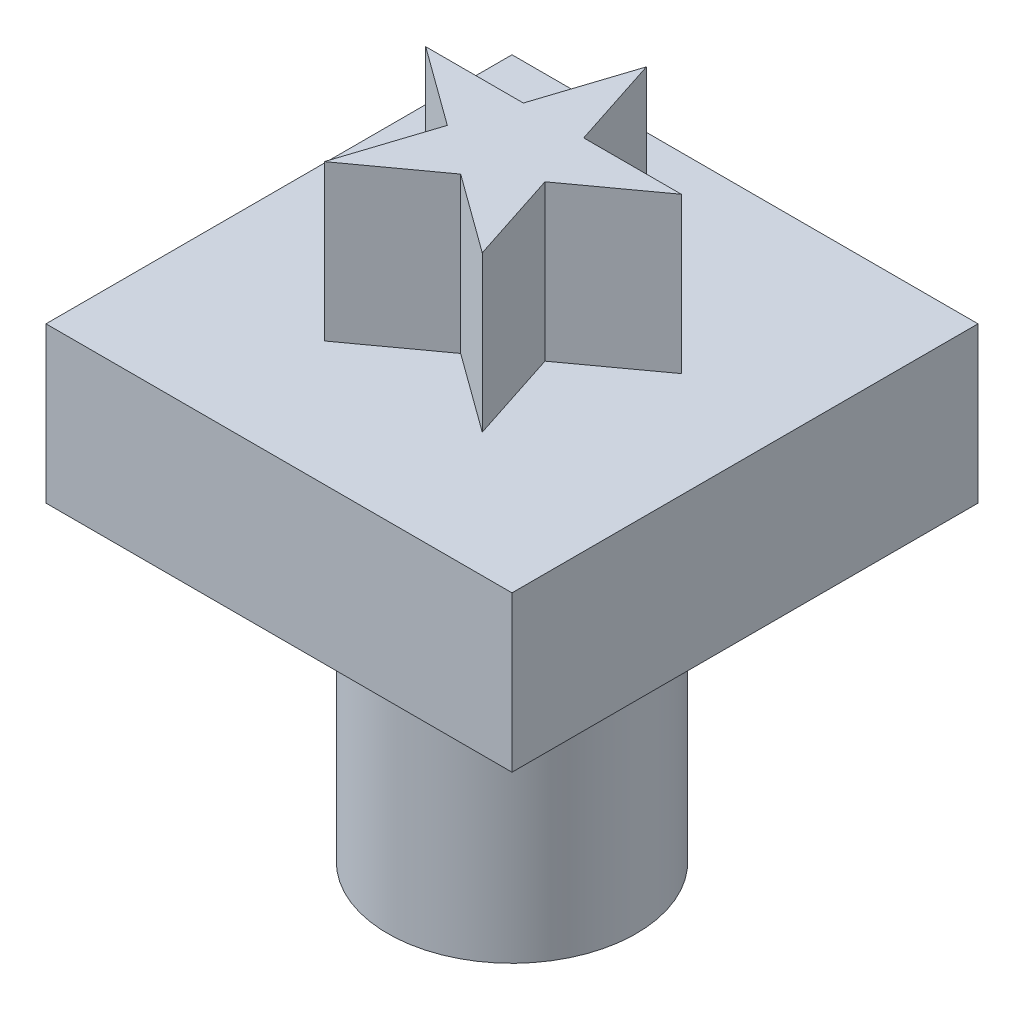
ISO-10303-21;
HEADER;
FILE_DESCRIPTION(('STEP AP214'),'2;1');
FILE_NAME('part.step','',(''),(''),'','','');
FILE_SCHEMA(('AUTOMOTIVE_DESIGN { 1 0 10303 214 1 1 1 1 }'));
ENDSEC;
DATA;
#1=APPLICATION_CONTEXT('core data for automotive mechanical design processes');
#2=APPLICATION_PROTOCOL_DEFINITION('international standard','automotive_design',2000,#1);
#3=PRODUCT_CONTEXT('',#1,'mechanical');
#4=PRODUCT('Part','Part','',(#3));
#5=PRODUCT_RELATED_PRODUCT_CATEGORY('part','',(#4));
#6=PRODUCT_DEFINITION_FORMATION('','',#4);
#7=PRODUCT_DEFINITION_CONTEXT('part definition',#1,'design');
#8=PRODUCT_DEFINITION('design','',#6,#7);
#9=PRODUCT_DEFINITION_SHAPE('','',#8);
#10=(LENGTH_UNIT() NAMED_UNIT(*) SI_UNIT(.MILLI.,.METRE.));
#11=(NAMED_UNIT(*) PLANE_ANGLE_UNIT() SI_UNIT($,.RADIAN.));
#12=(NAMED_UNIT(*) SI_UNIT($,.STERADIAN.) SOLID_ANGLE_UNIT());
#13=UNCERTAINTY_MEASURE_WITH_UNIT(LENGTH_MEASURE(1.E-05),#10,'distance_accuracy_value','');
#14=(GEOMETRIC_REPRESENTATION_CONTEXT(3) GLOBAL_UNCERTAINTY_ASSIGNED_CONTEXT((#13)) GLOBAL_UNIT_ASSIGNED_CONTEXT((#10,
#11,#12)) REPRESENTATION_CONTEXT('',''));
#15=CARTESIAN_POINT('',(0.,0.,0.));
#16=DIRECTION('',(0.,0.,1.));
#17=DIRECTION('',(1.,0.,0.));
#18=AXIS2_PLACEMENT_3D('',#15,#16,#17);
#19=CARTESIAN_POINT('',(-7.5,5.,7.5));
#20=DIRECTION('',(1.,0.,0.));
#21=DIRECTION('',(0.,0.,-1.));
#22=AXIS2_PLACEMENT_3D('',#19,#20,#21);
#23=PLANE('',#22);
#24=DIRECTION('',(0.,0.,1.));
#25=VECTOR('',#24,1.);
#26=CARTESIAN_POINT('',(-7.5,0.,7.5));
#27=LINE('',#26,#25);
#28=CARTESIAN_POINT('',(-7.5,0.,-7.5));
#29=VERTEX_POINT('',#28);
#30=CARTESIAN_POINT('',(-7.5,0.,7.5));
#31=VERTEX_POINT('',#30);
#32=EDGE_CURVE('E161',#29,#31,#27,.T.);
#33=ORIENTED_EDGE('',*,*,#32,.T.);
#34=DIRECTION('',(0.,-1.,0.));
#35=VECTOR('',#34,1.);
#36=CARTESIAN_POINT('',(-7.5,5.,7.5));
#37=LINE('',#36,#35);
#38=CARTESIAN_POINT('',(-7.5,5.,7.5));
#39=VERTEX_POINT('',#38);
#40=EDGE_CURVE('E40',#39,#31,#37,.T.);
#41=ORIENTED_EDGE('',*,*,#40,.F.);
#42=DIRECTION('',(0.,0.,1.));
#43=VECTOR('',#42,1.);
#44=CARTESIAN_POINT('',(-7.5,5.,7.5));
#45=LINE('',#44,#43);
#46=CARTESIAN_POINT('',(-7.5,5.,-7.5));
#47=VERTEX_POINT('',#46);
#48=EDGE_CURVE('E167',#47,#39,#45,.T.);
#49=ORIENTED_EDGE('',*,*,#48,.F.);
#50=DIRECTION('',(0.,-1.,0.));
#51=VECTOR('',#50,1.);
#52=CARTESIAN_POINT('',(-7.5,5.,-7.5));
#53=LINE('',#52,#51);
#54=EDGE_CURVE('E177',#47,#29,#53,.T.);
#55=ORIENTED_EDGE('',*,*,#54,.T.);
#56=EDGE_LOOP('',(#33,#41,#49,#55));
#57=FACE_BOUND('',#56,.T.);
#58=ADVANCED_FACE('F37',(#57),#23,.F.);
#59=CARTESIAN_POINT('',(7.5,5.,7.5));
#60=DIRECTION('',(0.,0.,-1.));
#61=DIRECTION('',(-1.,0.,0.));
#62=AXIS2_PLACEMENT_3D('',#59,#60,#61);
#63=PLANE('',#62);
#64=DIRECTION('',(1.,0.,0.));
#65=VECTOR('',#64,1.);
#66=CARTESIAN_POINT('',(7.5,0.,7.5));
#67=LINE('',#66,#65);
#68=CARTESIAN_POINT('',(7.5,0.,7.5));
#69=VERTEX_POINT('',#68);
#70=EDGE_CURVE('E180',#31,#69,#67,.T.);
#71=ORIENTED_EDGE('',*,*,#70,.T.);
#72=DIRECTION('',(0.,-1.,0.));
#73=VECTOR('',#72,1.);
#74=CARTESIAN_POINT('',(7.5,5.,7.5));
#75=LINE('',#74,#73);
#76=CARTESIAN_POINT('',(7.5,5.,7.5));
#77=VERTEX_POINT('',#76);
#78=EDGE_CURVE('E189',#77,#69,#75,.T.);
#79=ORIENTED_EDGE('',*,*,#78,.F.);
#80=DIRECTION('',(1.,0.,0.));
#81=VECTOR('',#80,1.);
#82=CARTESIAN_POINT('',(7.5,5.,7.5));
#83=LINE('',#82,#81);
#84=EDGE_CURVE('E170',#39,#77,#83,.T.);
#85=ORIENTED_EDGE('',*,*,#84,.F.);
#86=ORIENTED_EDGE('',*,*,#40,.T.);
#87=EDGE_LOOP('',(#71,#79,#85,#86));
#88=FACE_BOUND('',#87,.T.);
#89=ADVANCED_FACE('F198',(#88),#63,.F.);
#90=CARTESIAN_POINT('',(7.5,5.,7.5));
#91=DIRECTION('',(-1.,0.,0.));
#92=DIRECTION('',(0.,0.,1.));
#93=AXIS2_PLACEMENT_3D('',#90,#91,#92);
#94=PLANE('',#93);
#95=DIRECTION('',(0.,0.,-1.));
#96=VECTOR('',#95,1.);
#97=CARTESIAN_POINT('',(7.5,0.,7.5));
#98=LINE('',#97,#96);
#99=CARTESIAN_POINT('',(7.5,0.,-7.5));
#100=VERTEX_POINT('',#99);
#101=EDGE_CURVE('E182',#69,#100,#98,.T.);
#102=ORIENTED_EDGE('',*,*,#101,.T.);
#103=DIRECTION('',(0.,-1.,0.));
#104=VECTOR('',#103,1.);
#105=CARTESIAN_POINT('',(7.5,5.,-7.5));
#106=LINE('',#105,#104);
#107=CARTESIAN_POINT('',(7.5,5.,-7.5));
#108=VERTEX_POINT('',#107);
#109=EDGE_CURVE('E187',#108,#100,#106,.T.);
#110=ORIENTED_EDGE('',*,*,#109,.F.);
#111=DIRECTION('',(0.,0.,-1.));
#112=VECTOR('',#111,1.);
#113=CARTESIAN_POINT('',(7.5,5.,7.5));
#114=LINE('',#113,#112);
#115=EDGE_CURVE('E173',#77,#108,#114,.T.);
#116=ORIENTED_EDGE('',*,*,#115,.F.);
#117=ORIENTED_EDGE('',*,*,#78,.T.);
#118=EDGE_LOOP('',(#102,#110,#116,#117));
#119=FACE_BOUND('',#118,.T.);
#120=ADVANCED_FACE('F207',(#119),#94,.F.);
#121=CARTESIAN_POINT('',(7.5,5.,-7.5));
#122=DIRECTION('',(0.,0.,1.));
#123=DIRECTION('',(1.,0.,0.));
#124=AXIS2_PLACEMENT_3D('',#121,#122,#123);
#125=PLANE('',#124);
#126=DIRECTION('',(-1.,0.,0.));
#127=VECTOR('',#126,1.);
#128=CARTESIAN_POINT('',(7.5,0.,-7.5));
#129=LINE('',#128,#127);
#130=EDGE_CURVE('E171',#100,#29,#129,.T.);
#131=ORIENTED_EDGE('',*,*,#130,.T.);
#132=ORIENTED_EDGE('',*,*,#54,.F.);
#133=DIRECTION('',(-1.,0.,0.));
#134=VECTOR('',#133,1.);
#135=CARTESIAN_POINT('',(7.5,5.,-7.5));
#136=LINE('',#135,#134);
#137=EDGE_CURVE('E175',#108,#47,#136,.T.);
#138=ORIENTED_EDGE('',*,*,#137,.F.);
#139=ORIENTED_EDGE('',*,*,#109,.T.);
#140=EDGE_LOOP('',(#131,#132,#138,#139));
#141=FACE_BOUND('',#140,.T.);
#142=ADVANCED_FACE('F210',(#141),#125,.F.);
#143=CARTESIAN_POINT('',(0.,5.,0.));
#144=DIRECTION('',(0.,1.,0.));
#145=DIRECTION('',(0.,0.,1.));
#146=AXIS2_PLACEMENT_3D('',#143,#144,#145);
#147=PLANE('',#146);
#148=DIRECTION('',(0.809016994374947,0.,-0.587785252292474));
#149=VECTOR('',#148,1.);
#150=CARTESIAN_POINT('',(0.,5.,1.65247584249853));
#151=LINE('',#150,#149);
#152=CARTESIAN_POINT('',(-2.54289884801876,5.,3.5));
#153=VERTEX_POINT('',#152);
#154=CARTESIAN_POINT('',(0.,5.,1.65247584249853));
#155=VERTEX_POINT('',#154);
#156=EDGE_CURVE('E52',#153,#155,#151,.T.);
#157=ORIENTED_EDGE('',*,*,#156,.F.);
#158=DIRECTION('',(-0.309016994374946,0.,0.951056516295154));
#159=VECTOR('',#158,1.);
#160=CARTESIAN_POINT('',(-2.54289884801876,5.,3.5));
#161=LINE('',#160,#159);
#162=CARTESIAN_POINT('',(-1.57159791802855,5.,0.510643118126106));
#163=VERTEX_POINT('',#162);
#164=EDGE_CURVE('E56',#163,#153,#161,.T.);
#165=ORIENTED_EDGE('',*,*,#164,.F.);
#166=DIRECTION('',(0.809016994374948,0.,0.587785252292472));
#167=VECTOR('',#166,1.);
#168=CARTESIAN_POINT('',(-1.57159791802855,5.,0.510643118126106));
#169=LINE('',#168,#167);
#170=CARTESIAN_POINT('',(-4.11449676604731,5.,-1.33688103937536));
#171=VERTEX_POINT('',#170);
#172=EDGE_CURVE('E426',#171,#163,#169,.T.);
#173=ORIENTED_EDGE('',*,*,#172,.F.);
#174=DIRECTION('',(-1.,0.,0.));
#175=VECTOR('',#174,1.);
#176=CARTESIAN_POINT('',(-4.11449676604731,5.,-1.33688103937536));
#177=LINE('',#176,#175);
#178=CARTESIAN_POINT('',(-0.971300929990216,5.,-1.33688103937537));
#179=VERTEX_POINT('',#178);
#180=EDGE_CURVE('E472',#179,#171,#177,.T.);
#181=ORIENTED_EDGE('',*,*,#180,.F.);
#182=DIRECTION('',(-0.309016994374946,0.,0.951056516295154));
#183=VECTOR('',#182,1.);
#184=CARTESIAN_POINT('',(-0.971300929990216,5.,-1.33688103937537));
#185=LINE('',#184,#183);
#186=CARTESIAN_POINT('',(0.,5.,-4.32623792124926));
#187=VERTEX_POINT('',#186);
#188=EDGE_CURVE('E469',#187,#179,#185,.T.);
#189=ORIENTED_EDGE('',*,*,#188,.F.);
#190=DIRECTION('',(-0.309016994374949,0.,-0.951056516295153));
#191=VECTOR('',#190,1.);
#192=CARTESIAN_POINT('',(0.971300929990212,5.,-1.33688103937537));
#193=LINE('',#192,#191);
#194=CARTESIAN_POINT('',(0.971300929990212,5.,-1.33688103937537));
#195=VERTEX_POINT('',#194);
#196=EDGE_CURVE('E466',#195,#187,#193,.T.);
#197=ORIENTED_EDGE('',*,*,#196,.F.);
#198=DIRECTION('',(-1.,0.,0.));
#199=VECTOR('',#198,1.);
#200=CARTESIAN_POINT('',(0.971300929990212,5.,-1.33688103937537));
#201=LINE('',#200,#199);
#202=CARTESIAN_POINT('',(4.11449676604731,5.,-1.33688103937537));
#203=VERTEX_POINT('',#202);
#204=EDGE_CURVE('E459',#203,#195,#201,.T.);
#205=ORIENTED_EDGE('',*,*,#204,.F.);
#206=DIRECTION('',(0.809016994374947,0.,-0.587785252292474));
#207=VECTOR('',#206,1.);
#208=CARTESIAN_POINT('',(4.11449676604731,5.,-1.33688103937537));
#209=LINE('',#208,#207);
#210=CARTESIAN_POINT('',(1.57159791802855,5.,0.510643118126103));
#211=VERTEX_POINT('',#210);
#212=EDGE_CURVE('E453',#211,#203,#209,.T.);
#213=ORIENTED_EDGE('',*,*,#212,.F.);
#214=DIRECTION('',(-0.309016994374946,0.,-0.951056516295154));
#215=VECTOR('',#214,1.);
#216=CARTESIAN_POINT('',(2.54289884801876,5.,3.50000000000001));
#217=LINE('',#216,#215);
#218=CARTESIAN_POINT('',(2.54289884801876,5.,3.50000000000001));
#219=VERTEX_POINT('',#218);
#220=EDGE_CURVE('E456',#219,#211,#217,.T.);
#221=ORIENTED_EDGE('',*,*,#220,.F.);
#222=DIRECTION('',(0.809016994374947,0.,0.587785252292474));
#223=VECTOR('',#222,1.);
#224=CARTESIAN_POINT('',(2.54289884801876,5.,3.50000000000001));
#225=LINE('',#224,#223);
#226=EDGE_CURVE('E457',#155,#219,#225,.T.);
#227=ORIENTED_EDGE('',*,*,#226,.F.);
#228=EDGE_LOOP('',(#157,#165,#173,#181,#189,#197,#205,#213,#221,#227));
#229=FACE_BOUND('',#228,.T.);
#230=ORIENTED_EDGE('',*,*,#48,.T.);
#231=ORIENTED_EDGE('',*,*,#84,.T.);
#232=ORIENTED_EDGE('',*,*,#115,.T.);
#233=ORIENTED_EDGE('',*,*,#137,.T.);
#234=EDGE_LOOP('',(#230,#231,#232,#233));
#235=FACE_BOUND('',#234,.T.);
#236=ADVANCED_FACE('F212',(#229,#235),#147,.T.);
#237=CARTESIAN_POINT('',(0.,0.,0.));
#238=DIRECTION('',(0.,1.,0.));
#239=DIRECTION('',(0.,0.,1.));
#240=AXIS2_PLACEMENT_3D('',#237,#238,#239);
#241=PLANE('',#240);
#242=CARTESIAN_POINT('',(0.,0.,0.));
#243=DIRECTION('',(0.,-1.,0.));
#244=DIRECTION('',(0.,0.,-1.));
#245=AXIS2_PLACEMENT_3D('',#242,#243,#244);
#246=CIRCLE('',#245,4.);
#247=CARTESIAN_POINT('',(0.,0.,-4.));
#248=VERTEX_POINT('',#247);
#249=EDGE_CURVE('E11',#248,#248,#246,.T.);
#250=ORIENTED_EDGE('',*,*,#249,.F.);
#251=EDGE_LOOP('',(#250));
#252=FACE_BOUND('',#251,.T.);
#253=ORIENTED_EDGE('',*,*,#32,.F.);
#254=ORIENTED_EDGE('',*,*,#130,.F.);
#255=ORIENTED_EDGE('',*,*,#101,.F.);
#256=ORIENTED_EDGE('',*,*,#70,.F.);
#257=EDGE_LOOP('',(#253,#254,#255,#256));
#258=FACE_BOUND('',#257,.T.);
#259=ADVANCED_FACE('F205',(#252,#258),#241,.F.);
#260=CARTESIAN_POINT('',(0.,-10.,0.));
#261=DIRECTION('',(0.,1.,0.));
#262=DIRECTION('',(0.,0.,1.));
#263=AXIS2_PLACEMENT_3D('',#260,#261,#262);
#264=CYLINDRICAL_SURFACE('',#263,4.);
#265=CARTESIAN_POINT('',(0.,-10.,0.));
#266=DIRECTION('',(0.,-1.,0.));
#267=DIRECTION('',(0.,0.,-1.));
#268=AXIS2_PLACEMENT_3D('',#265,#266,#267);
#269=CIRCLE('',#268,4.);
#270=CARTESIAN_POINT('',(0.,-10.,-4.));
#271=VERTEX_POINT('',#270);
#272=EDGE_CURVE('E158',#271,#271,#269,.T.);
#273=ORIENTED_EDGE('',*,*,#272,.F.);
#274=EDGE_LOOP('',(#273));
#275=FACE_BOUND('',#274,.T.);
#276=ORIENTED_EDGE('',*,*,#249,.T.);
#277=EDGE_LOOP('',(#276));
#278=FACE_BOUND('',#277,.T.);
#279=ADVANCED_FACE('F219',(#275,#278),#264,.T.);
#280=CARTESIAN_POINT('',(0.,-10.,0.));
#281=DIRECTION('',(0.,-1.,0.));
#282=DIRECTION('',(0.,0.,-1.));
#283=AXIS2_PLACEMENT_3D('',#280,#281,#282);
#284=PLANE('',#283);
#285=ORIENTED_EDGE('',*,*,#272,.T.);
#286=EDGE_LOOP('',(#285));
#287=FACE_BOUND('',#286,.T.);
#288=ADVANCED_FACE('F256',(#287),#284,.T.);
#289=CARTESIAN_POINT('',(0.,10.,1.65247584249853));
#290=DIRECTION('',(-0.587785252292474,0.,-0.809016994374947));
#291=DIRECTION('',(-0.809016994374947,0.,0.587785252292474));
#292=AXIS2_PLACEMENT_3D('',#289,#290,#291);
#293=PLANE('',#292);
#294=ORIENTED_EDGE('',*,*,#156,.T.);
#295=DIRECTION('',(0.,-1.,0.));
#296=VECTOR('',#295,1.);
#297=CARTESIAN_POINT('',(0.,10.,1.65247584249853));
#298=LINE('',#297,#296);
#299=CARTESIAN_POINT('',(0.,10.,1.65247584249853));
#300=VERTEX_POINT('',#299);
#301=EDGE_CURVE('E141',#300,#155,#298,.T.);
#302=ORIENTED_EDGE('',*,*,#301,.F.);
#303=DIRECTION('',(0.809016994374947,0.,-0.587785252292474));
#304=VECTOR('',#303,1.);
#305=CARTESIAN_POINT('',(0.,10.,1.65247584249853));
#306=LINE('',#305,#304);
#307=CARTESIAN_POINT('',(-2.54289884801876,10.,3.5));
#308=VERTEX_POINT('',#307);
#309=EDGE_CURVE('E147',#308,#300,#306,.T.);
#310=ORIENTED_EDGE('',*,*,#309,.F.);
#311=DIRECTION('',(0.,-1.,0.));
#312=VECTOR('',#311,1.);
#313=CARTESIAN_POINT('',(-2.54289884801876,10.,3.5));
#314=LINE('',#313,#312);
#315=EDGE_CURVE('E423',#308,#153,#314,.T.);
#316=ORIENTED_EDGE('',*,*,#315,.T.);
#317=EDGE_LOOP('',(#294,#302,#310,#316));
#318=FACE_BOUND('',#317,.T.);
#319=ADVANCED_FACE('F157',(#318),#293,.F.);
#320=CARTESIAN_POINT('',(2.54289884801876,10.,3.50000000000001));
#321=DIRECTION('',(0.587785252292474,0.,-0.809016994374947));
#322=DIRECTION('',(-0.809016994374947,0.,-0.587785252292474));
#323=AXIS2_PLACEMENT_3D('',#320,#321,#322);
#324=PLANE('',#323);
#325=ORIENTED_EDGE('',*,*,#226,.T.);
#326=DIRECTION('',(0.,-1.,0.));
#327=VECTOR('',#326,1.);
#328=CARTESIAN_POINT('',(2.54289884801876,10.,3.50000000000001));
#329=LINE('',#328,#327);
#330=CARTESIAN_POINT('',(2.54289884801876,10.,3.50000000000001));
#331=VERTEX_POINT('',#330);
#332=EDGE_CURVE('E143',#331,#219,#329,.T.);
#333=ORIENTED_EDGE('',*,*,#332,.F.);
#334=DIRECTION('',(0.809016994374947,0.,0.587785252292474));
#335=VECTOR('',#334,1.);
#336=CARTESIAN_POINT('',(2.54289884801876,10.,3.50000000000001));
#337=LINE('',#336,#335);
#338=EDGE_CURVE('E136',#300,#331,#337,.T.);
#339=ORIENTED_EDGE('',*,*,#338,.F.);
#340=ORIENTED_EDGE('',*,*,#301,.T.);
#341=EDGE_LOOP('',(#325,#333,#339,#340));
#342=FACE_BOUND('',#341,.T.);
#343=ADVANCED_FACE('F139',(#342),#324,.F.);
#344=CARTESIAN_POINT('',(2.54289884801876,10.,3.50000000000001));
#345=DIRECTION('',(-0.951056516295154,0.,0.309016994374946));
#346=DIRECTION('',(0.309016994374946,0.,0.951056516295154));
#347=AXIS2_PLACEMENT_3D('',#344,#345,#346);
#348=PLANE('',#347);
#349=ORIENTED_EDGE('',*,*,#220,.T.);
#350=DIRECTION('',(0.,-1.,0.));
#351=VECTOR('',#350,1.);
#352=CARTESIAN_POINT('',(1.57159791802855,10.,0.510643118126103));
#353=LINE('',#352,#351);
#354=CARTESIAN_POINT('',(1.57159791802855,10.,0.510643118126103));
#355=VERTEX_POINT('',#354);
#356=EDGE_CURVE('E163',#355,#211,#353,.T.);
#357=ORIENTED_EDGE('',*,*,#356,.F.);
#358=DIRECTION('',(-0.309016994374946,0.,-0.951056516295154));
#359=VECTOR('',#358,1.);
#360=CARTESIAN_POINT('',(2.54289884801876,10.,3.50000000000001));
#361=LINE('',#360,#359);
#362=EDGE_CURVE('E146',#331,#355,#361,.T.);
#363=ORIENTED_EDGE('',*,*,#362,.F.);
#364=ORIENTED_EDGE('',*,*,#332,.T.);
#365=EDGE_LOOP('',(#349,#357,#363,#364));
#366=FACE_BOUND('',#365,.T.);
#367=ADVANCED_FACE('F289',(#366),#348,.F.);
#368=CARTESIAN_POINT('',(4.11449676604731,10.,-1.33688103937537));
#369=DIRECTION('',(-0.587785252292474,0.,-0.809016994374947));
#370=DIRECTION('',(-0.809016994374947,0.,0.587785252292474));
#371=AXIS2_PLACEMENT_3D('',#368,#369,#370);
#372=PLANE('',#371);
#373=ORIENTED_EDGE('',*,*,#212,.T.);
#374=DIRECTION('',(0.,-1.,0.));
#375=VECTOR('',#374,1.);
#376=CARTESIAN_POINT('',(4.11449676604731,10.,-1.33688103937537));
#377=LINE('',#376,#375);
#378=CARTESIAN_POINT('',(4.11449676604731,10.,-1.33688103937537));
#379=VERTEX_POINT('',#378);
#380=EDGE_CURVE('E446',#379,#203,#377,.T.);
#381=ORIENTED_EDGE('',*,*,#380,.F.);
#382=DIRECTION('',(0.809016994374947,0.,-0.587785252292474));
#383=VECTOR('',#382,1.);
#384=CARTESIAN_POINT('',(4.11449676604731,10.,-1.33688103937537));
#385=LINE('',#384,#383);
#386=EDGE_CURVE('E454',#355,#379,#385,.T.);
#387=ORIENTED_EDGE('',*,*,#386,.F.);
#388=ORIENTED_EDGE('',*,*,#356,.T.);
#389=EDGE_LOOP('',(#373,#381,#387,#388));
#390=FACE_BOUND('',#389,.T.);
#391=ADVANCED_FACE('F299',(#390),#372,.F.);
#392=CARTESIAN_POINT('',(0.971300929990212,10.,-1.33688103937537));
#393=DIRECTION('',(0.,0.,1.));
#394=DIRECTION('',(1.,0.,0.));
#395=AXIS2_PLACEMENT_3D('',#392,#393,#394);
#396=PLANE('',#395);
#397=ORIENTED_EDGE('',*,*,#204,.T.);
#398=DIRECTION('',(0.,-1.,0.));
#399=VECTOR('',#398,1.);
#400=CARTESIAN_POINT('',(0.971300929990212,10.,-1.33688103937537));
#401=LINE('',#400,#399);
#402=CARTESIAN_POINT('',(0.971300929990212,10.,-1.33688103937537));
#403=VERTEX_POINT('',#402);
#404=EDGE_CURVE('E443',#403,#195,#401,.T.);
#405=ORIENTED_EDGE('',*,*,#404,.F.);
#406=DIRECTION('',(-1.,0.,0.));
#407=VECTOR('',#406,1.);
#408=CARTESIAN_POINT('',(0.971300929990212,10.,-1.33688103937537));
#409=LINE('',#408,#407);
#410=EDGE_CURVE('E486',#379,#403,#409,.T.);
#411=ORIENTED_EDGE('',*,*,#410,.F.);
#412=ORIENTED_EDGE('',*,*,#380,.T.);
#413=EDGE_LOOP('',(#397,#405,#411,#412));
#414=FACE_BOUND('',#413,.T.);
#415=ADVANCED_FACE('F310',(#414),#396,.F.);
#416=CARTESIAN_POINT('',(0.971300929990212,10.,-1.33688103937537));
#417=DIRECTION('',(-0.951056516295153,0.,0.309016994374949));
#418=DIRECTION('',(0.309016994374949,0.,0.951056516295153));
#419=AXIS2_PLACEMENT_3D('',#416,#417,#418);
#420=PLANE('',#419);
#421=ORIENTED_EDGE('',*,*,#196,.T.);
#422=DIRECTION('',(0.,-1.,0.));
#423=VECTOR('',#422,1.);
#424=CARTESIAN_POINT('',(0.,10.,-4.32623792124926));
#425=LINE('',#424,#423);
#426=CARTESIAN_POINT('',(0.,10.,-4.32623792124926));
#427=VERTEX_POINT('',#426);
#428=EDGE_CURVE('E440',#427,#187,#425,.T.);
#429=ORIENTED_EDGE('',*,*,#428,.F.);
#430=DIRECTION('',(-0.309016994374949,0.,-0.951056516295153));
#431=VECTOR('',#430,1.);
#432=CARTESIAN_POINT('',(0.971300929990212,10.,-1.33688103937537));
#433=LINE('',#432,#431);
#434=EDGE_CURVE('E484',#403,#427,#433,.T.);
#435=ORIENTED_EDGE('',*,*,#434,.F.);
#436=ORIENTED_EDGE('',*,*,#404,.T.);
#437=EDGE_LOOP('',(#421,#429,#435,#436));
#438=FACE_BOUND('',#437,.T.);
#439=ADVANCED_FACE('F321',(#438),#420,.F.);
#440=CARTESIAN_POINT('',(-0.971300929990216,10.,-1.33688103937537));
#441=DIRECTION('',(0.951056516295154,0.,0.309016994374946));
#442=DIRECTION('',(0.309016994374946,0.,-0.951056516295154));
#443=AXIS2_PLACEMENT_3D('',#440,#441,#442);
#444=PLANE('',#443);
#445=ORIENTED_EDGE('',*,*,#188,.T.);
#446=DIRECTION('',(0.,-1.,0.));
#447=VECTOR('',#446,1.);
#448=CARTESIAN_POINT('',(-0.971300929990216,10.,-1.33688103937537));
#449=LINE('',#448,#447);
#450=CARTESIAN_POINT('',(-0.971300929990216,10.,-1.33688103937537));
#451=VERTEX_POINT('',#450);
#452=EDGE_CURVE('E437',#451,#179,#449,.T.);
#453=ORIENTED_EDGE('',*,*,#452,.F.);
#454=DIRECTION('',(-0.309016994374946,0.,0.951056516295154));
#455=VECTOR('',#454,1.);
#456=CARTESIAN_POINT('',(-0.971300929990216,10.,-1.33688103937537));
#457=LINE('',#456,#455);
#458=EDGE_CURVE('E480',#427,#451,#457,.T.);
#459=ORIENTED_EDGE('',*,*,#458,.F.);
#460=ORIENTED_EDGE('',*,*,#428,.T.);
#461=EDGE_LOOP('',(#445,#453,#459,#460));
#462=FACE_BOUND('',#461,.T.);
#463=ADVANCED_FACE('F332',(#462),#444,.F.);
#464=CARTESIAN_POINT('',(-4.11449676604731,10.,-1.33688103937536));
#465=DIRECTION('',(0.,0.,1.));
#466=DIRECTION('',(1.,0.,0.));
#467=AXIS2_PLACEMENT_3D('',#464,#465,#466);
#468=PLANE('',#467);
#469=ORIENTED_EDGE('',*,*,#180,.T.);
#470=DIRECTION('',(0.,-1.,0.));
#471=VECTOR('',#470,1.);
#472=CARTESIAN_POINT('',(-4.11449676604731,10.,-1.33688103937536));
#473=LINE('',#472,#471);
#474=CARTESIAN_POINT('',(-4.11449676604731,10.,-1.33688103937536));
#475=VERTEX_POINT('',#474);
#476=EDGE_CURVE('E429',#475,#171,#473,.T.);
#477=ORIENTED_EDGE('',*,*,#476,.F.);
#478=DIRECTION('',(-1.,0.,0.));
#479=VECTOR('',#478,1.);
#480=CARTESIAN_POINT('',(-4.11449676604731,10.,-1.33688103937536));
#481=LINE('',#480,#479);
#482=EDGE_CURVE('E478',#451,#475,#481,.T.);
#483=ORIENTED_EDGE('',*,*,#482,.F.);
#484=ORIENTED_EDGE('',*,*,#452,.T.);
#485=EDGE_LOOP('',(#469,#477,#483,#484));
#486=FACE_BOUND('',#485,.T.);
#487=ADVANCED_FACE('F343',(#486),#468,.F.);
#488=CARTESIAN_POINT('',(-1.57159791802855,10.,0.510643118126106));
#489=DIRECTION('',(0.587785252292472,0.,-0.809016994374948));
#490=DIRECTION('',(-0.809016994374948,0.,-0.587785252292472));
#491=AXIS2_PLACEMENT_3D('',#488,#489,#490);
#492=PLANE('',#491);
#493=ORIENTED_EDGE('',*,*,#172,.T.);
#494=DIRECTION('',(0.,-1.,0.));
#495=VECTOR('',#494,1.);
#496=CARTESIAN_POINT('',(-1.57159791802855,10.,0.510643118126106));
#497=LINE('',#496,#495);
#498=CARTESIAN_POINT('',(-1.57159791802855,10.,0.510643118126106));
#499=VERTEX_POINT('',#498);
#500=EDGE_CURVE('E425',#499,#163,#497,.T.);
#501=ORIENTED_EDGE('',*,*,#500,.F.);
#502=DIRECTION('',(0.809016994374948,0.,0.587785252292472));
#503=VECTOR('',#502,1.);
#504=CARTESIAN_POINT('',(-1.57159791802855,10.,0.510643118126106));
#505=LINE('',#504,#503);
#506=EDGE_CURVE('E431',#475,#499,#505,.T.);
#507=ORIENTED_EDGE('',*,*,#506,.F.);
#508=ORIENTED_EDGE('',*,*,#476,.T.);
#509=EDGE_LOOP('',(#493,#501,#507,#508));
#510=FACE_BOUND('',#509,.T.);
#511=ADVANCED_FACE('F354',(#510),#492,.F.);
#512=CARTESIAN_POINT('',(-2.54289884801876,10.,3.5));
#513=DIRECTION('',(0.951056516295154,0.,0.309016994374946));
#514=DIRECTION('',(0.309016994374947,0.,-0.951056516295154));
#515=AXIS2_PLACEMENT_3D('',#512,#513,#514);
#516=PLANE('',#515);
#517=ORIENTED_EDGE('',*,*,#164,.T.);
#518=ORIENTED_EDGE('',*,*,#315,.F.);
#519=DIRECTION('',(-0.309016994374946,0.,0.951056516295154));
#520=VECTOR('',#519,1.);
#521=CARTESIAN_POINT('',(-2.54289884801876,10.,3.5));
#522=LINE('',#521,#520);
#523=EDGE_CURVE('E152',#499,#308,#522,.T.);
#524=ORIENTED_EDGE('',*,*,#523,.F.);
#525=ORIENTED_EDGE('',*,*,#500,.T.);
#526=EDGE_LOOP('',(#517,#518,#524,#525));
#527=FACE_BOUND('',#526,.T.);
#528=ADVANCED_FACE('F365',(#527),#516,.F.);
#529=CARTESIAN_POINT('',(0.,10.,0.));
#530=DIRECTION('',(0.,-1.,0.));
#531=DIRECTION('',(0.,0.,-1.));
#532=AXIS2_PLACEMENT_3D('',#529,#530,#531);
#533=PLANE('',#532);
#534=ORIENTED_EDGE('',*,*,#309,.T.);
#535=ORIENTED_EDGE('',*,*,#338,.T.);
#536=ORIENTED_EDGE('',*,*,#362,.T.);
#537=ORIENTED_EDGE('',*,*,#386,.T.);
#538=ORIENTED_EDGE('',*,*,#410,.T.);
#539=ORIENTED_EDGE('',*,*,#434,.T.);
#540=ORIENTED_EDGE('',*,*,#458,.T.);
#541=ORIENTED_EDGE('',*,*,#482,.T.);
#542=ORIENTED_EDGE('',*,*,#506,.T.);
#543=ORIENTED_EDGE('',*,*,#523,.T.);
#544=EDGE_LOOP('',(#534,#535,#536,#537,#538,#539,#540,#541,#542,#543));
#545=FACE_BOUND('',#544,.T.);
#546=ADVANCED_FACE('F150',(#545),#533,.F.);
#547=CLOSED_SHELL('',(#58,#89,#120,#142,#236,#259,#279,#288,#319,#343,#367,#391,#415,#439,#463,
#487,#511,#528,#546));
#548=MANIFOLD_SOLID_BREP('B2',#547);
#549=ADVANCED_BREP_SHAPE_REPRESENTATION('',(#18,#548),#14);
#550=SHAPE_DEFINITION_REPRESENTATION(#9,#549);
ENDSEC;
END-ISO-10303-21;
